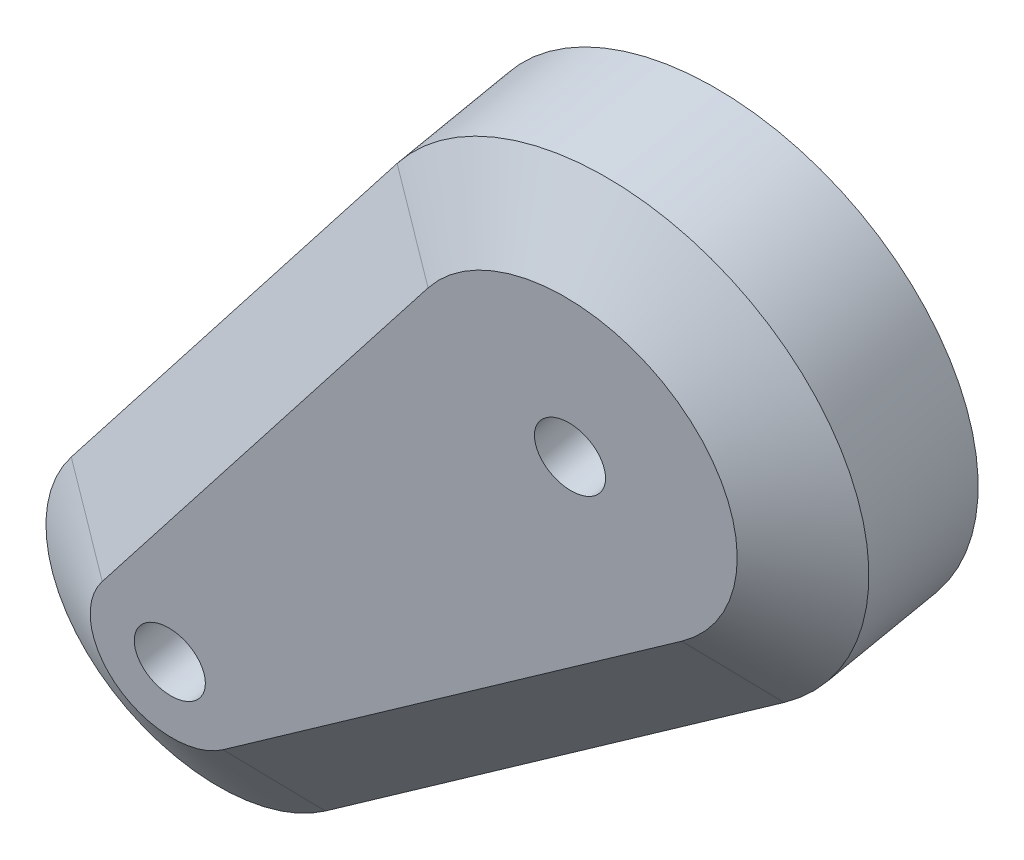
ISO-10303-21;
HEADER;
FILE_DESCRIPTION(('STEP AP214'),'2;1');
FILE_NAME('part.step','',(''),(''),'','','');
FILE_SCHEMA(('AUTOMOTIVE_DESIGN { 1 0 10303 214 1 1 1 1 }'));
ENDSEC;
DATA;
#1=APPLICATION_CONTEXT('core data for automotive mechanical design processes');
#2=APPLICATION_PROTOCOL_DEFINITION('international standard','automotive_design',2000,#1);
#3=PRODUCT_CONTEXT('',#1,'mechanical');
#4=PRODUCT('Part','Part','',(#3));
#5=PRODUCT_RELATED_PRODUCT_CATEGORY('part','',(#4));
#6=PRODUCT_DEFINITION_FORMATION('','',#4);
#7=PRODUCT_DEFINITION_CONTEXT('part definition',#1,'design');
#8=PRODUCT_DEFINITION('design','',#6,#7);
#9=PRODUCT_DEFINITION_SHAPE('','',#8);
#10=(LENGTH_UNIT() NAMED_UNIT(*) SI_UNIT(.MILLI.,.METRE.));
#11=(NAMED_UNIT(*) PLANE_ANGLE_UNIT() SI_UNIT($,.RADIAN.));
#12=(NAMED_UNIT(*) SI_UNIT($,.STERADIAN.) SOLID_ANGLE_UNIT());
#13=UNCERTAINTY_MEASURE_WITH_UNIT(LENGTH_MEASURE(1.E-05),#10,'distance_accuracy_value','');
#14=(GEOMETRIC_REPRESENTATION_CONTEXT(3) GLOBAL_UNCERTAINTY_ASSIGNED_CONTEXT((#13)) GLOBAL_UNIT_ASSIGNED_CONTEXT((#10,
#11,#12)) REPRESENTATION_CONTEXT('',''));
#15=CARTESIAN_POINT('',(0.,0.,0.));
#16=DIRECTION('',(0.,0.,1.));
#17=DIRECTION('',(1.,0.,0.));
#18=AXIS2_PLACEMENT_3D('',#15,#16,#17);
#19=CARTESIAN_POINT('',(139.042388148366,-142.913532001662,-5.92533887196867));
#20=DIRECTION('',(0.0674581133210909,-0.12352330189874,0.990046158941689));
#21=DIRECTION('',(0.,-0.992306526958391,-0.123805317154703));
#22=AXIS2_PLACEMENT_3D('',#19,#20,#21);
#23=PLANE('',#22);
#24=CARTESIAN_POINT('',(156.822676569582,-126.081367524923,-5.03675421849172));
#25=DIRECTION('',(0.0674581133210909,-0.12352330189874,0.990046158941689));
#26=DIRECTION('',(0.,-0.992306526958391,-0.123805317154703));
#27=AXIS2_PLACEMENT_3D('',#24,#25,#26);
#28=CIRCLE('',#27,6.58589838486229);
#29=CARTESIAN_POINT('',(160.613864154695,-131.38739760596,-5.95707970947262));
#30=VERTEX_POINT('',#29);
#31=CARTESIAN_POINT('',(151.685409363827,-122.049638120943,-4.18370017243479));
#32=VERTEX_POINT('',#31);
#33=EDGE_CURVE('E190',#30,#32,#28,.T.);
#34=ORIENTED_EDGE('',*,*,#33,.T.);
#35=DIRECTION('',(-0.622082216176631,-0.781013732742278,-0.0550569303970384));
#36=VECTOR('',#35,1.);
#37=CARTESIAN_POINT('',(136.596260529671,-140.993810046157,-5.51915422578908));
#38=LINE('',#37,#36);
#39=CARTESIAN_POINT('',(136.596260529671,-140.993810046157,-5.51915422578908));
#40=VERTEX_POINT('',#39);
#41=EDGE_CURVE('E194',#32,#40,#38,.T.);
#42=ORIENTED_EDGE('',*,*,#41,.T.);
#43=CARTESIAN_POINT('',(139.042388148366,-142.913532001662,-5.92533887196867));
#44=DIRECTION('',(0.0674581133210909,-0.12352330189874,0.990046158941689));
#45=DIRECTION('',(0.,-0.992306526958391,-0.123805317154703));
#46=AXIS2_PLACEMENT_3D('',#43,#44,#45);
#47=CIRCLE('',#46,3.13589838486216);
#48=CARTESIAN_POINT('',(140.847575281559,-145.440016649436,-6.36355505024256));
#49=VERTEX_POINT('',#48);
#50=EDGE_CURVE('E192',#40,#49,#47,.T.);
#51=ORIENTED_EDGE('',*,*,#50,.T.);
#52=DIRECTION('',(0.814907250431126,0.579349073545028,0.0167578094421691));
#53=VECTOR('',#52,1.);
#54=CARTESIAN_POINT('',(140.847575281559,-145.440016649436,-6.36355505024256));
#55=LINE('',#54,#53);
#56=EDGE_CURVE('E188',#49,#30,#55,.T.);
#57=ORIENTED_EDGE('',*,*,#56,.T.);
#58=EDGE_LOOP('',(#34,#42,#51,#57));
#59=FACE_BOUND('',#58,.T.);
#60=CARTESIAN_POINT('',(156.822676569582,-126.081367524923,-5.03675421849172));
#61=DIRECTION('',(0.0674581133210909,-0.12352330189874,0.990046158941689));
#62=DIRECTION('',(0.,-0.992306526958391,-0.123805317154703));
#63=AXIS2_PLACEMENT_3D('',#60,#61,#62);
#64=CIRCLE('',#63,1.40000000000001);
#65=CARTESIAN_POINT('',(156.822676569582,-127.470596662665,-5.2100816625083));
#66=VERTEX_POINT('',#65);
#67=EDGE_CURVE('E143',#66,#66,#64,.T.);
#68=ORIENTED_EDGE('',*,*,#67,.F.);
#69=EDGE_LOOP('',(#68));
#70=FACE_BOUND('',#69,.T.);
#71=CARTESIAN_POINT('',(139.042388148366,-142.913532001662,-5.92533887196866));
#72=DIRECTION('',(0.0674581133210909,-0.12352330189874,0.990046158941689));
#73=DIRECTION('',(0.,-0.992306526958391,-0.123805317154703));
#74=AXIS2_PLACEMENT_3D('',#71,#72,#73);
#75=CIRCLE('',#74,1.40000000000001);
#76=CARTESIAN_POINT('',(139.042388148366,-144.302761139403,-6.09866631598525));
#77=VERTEX_POINT('',#76);
#78=EDGE_CURVE('E146',#77,#77,#75,.T.);
#79=ORIENTED_EDGE('',*,*,#78,.F.);
#80=EDGE_LOOP('',(#79));
#81=FACE_BOUND('',#80,.T.);
#82=ADVANCED_FACE('F39',(#59,#70,#81),#23,.T.);
#83=CARTESIAN_POINT('',(138.570181355119,-142.048868888371,-12.8556619845605));
#84=DIRECTION('',(0.0674581133210909,-0.12352330189874,0.990046158941689));
#85=DIRECTION('',(0.,-0.992306526958391,-0.123805317154703));
#86=AXIS2_PLACEMENT_3D('',#83,#84,#85);
#87=CYLINDRICAL_SURFACE('',#86,4.10000000000003);
#88=DIRECTION('',(0.0674581133210909,-0.12352330189874,0.990046158941689));
#89=VECTOR('',#88,1.);
#90=CARTESIAN_POINT('',(135.372015469048,-139.538946993081,-12.324599799199));
#91=LINE('',#90,#89);
#92=CARTESIAN_POINT('',(135.372015469048,-139.538946993081,-12.324599799199));
#93=VERTEX_POINT('',#92);
#94=CARTESIAN_POINT('',(135.675576978993,-140.094801851626,-7.86939208396144));
#95=VERTEX_POINT('',#94);
#96=EDGE_CURVE('E152',#93,#95,#91,.T.);
#97=ORIENTED_EDGE('',*,*,#96,.T.);
#98=CARTESIAN_POINT('',(138.873742865064,-142.604723746915,-8.40045426932289));
#99=DIRECTION('',(0.0674581133210909,-0.12352330189874,0.990046158941689));
#100=DIRECTION('',(0.,-0.992306526958391,-0.123805317154703));
#101=AXIS2_PLACEMENT_3D('',#98,#99,#100);
#102=CIRCLE('',#101,4.10000000000001);
#103=CARTESIAN_POINT('',(141.233917315172,-145.907951653111,-8.97339577138049));
#104=VERTEX_POINT('',#103);
#105=EDGE_CURVE('E125',#95,#104,#102,.T.);
#106=ORIENTED_EDGE('',*,*,#105,.T.);
#107=DIRECTION('',(0.0674581133210909,-0.12352330189874,0.990046158941689));
#108=VECTOR('',#107,1.);
#109=CARTESIAN_POINT('',(140.930355805227,-145.352096794567,-13.4286034866181));
#110=LINE('',#109,#108);
#111=CARTESIAN_POINT('',(140.930355805227,-145.352096794567,-13.4286034866181));
#112=VERTEX_POINT('',#111);
#113=EDGE_CURVE('E118',#112,#104,#110,.T.);
#114=ORIENTED_EDGE('',*,*,#113,.F.);
#115=CARTESIAN_POINT('',(138.570181355119,-142.048868888371,-12.8556619845605));
#116=DIRECTION('',(0.0674581133210909,-0.12352330189874,0.990046158941689));
#117=DIRECTION('',(0.,-0.992306526958391,-0.123805317154703));
#118=AXIS2_PLACEMENT_3D('',#115,#116,#117);
#119=CIRCLE('',#118,4.10000000000003);
#120=EDGE_CURVE('E123',#93,#112,#119,.T.);
#121=ORIENTED_EDGE('',*,*,#120,.F.);
#122=EDGE_LOOP('',(#97,#106,#114,#121));
#123=FACE_BOUND('',#122,.T.);
#124=ADVANCED_FACE('F121',(#123),#87,.F.);
#125=CARTESIAN_POINT('',(150.461164303204,-120.594775067867,-10.9891457458448));
#126=DIRECTION('',(-0.780040460017252,0.612176072021776,0.12952736228328));
#127=DIRECTION('',(-0.617376949257776,-0.786667466293835,0.));
#128=AXIS2_PLACEMENT_3D('',#125,#126,#127);
#129=PLANE('',#128);
#130=DIRECTION('',(0.0674581133210909,-0.12352330189874,0.990046158941689));
#131=VECTOR('',#130,1.);
#132=CARTESIAN_POINT('',(150.461164303204,-120.594775067867,-10.9891457458448));
#133=LINE('',#132,#131);
#134=CARTESIAN_POINT('',(150.461164303204,-120.594775067867,-10.9891457458448));
#135=VERTEX_POINT('',#134);
#136=CARTESIAN_POINT('',(150.764725813149,-121.150629926412,-6.53393803060717));
#137=VERTEX_POINT('',#136);
#138=EDGE_CURVE('E155',#135,#137,#133,.T.);
#139=ORIENTED_EDGE('',*,*,#138,.T.);
#140=DIRECTION('',(-0.622082216176634,-0.781013732742276,-0.0550569303970381));
#141=VECTOR('',#140,1.);
#142=CARTESIAN_POINT('',(135.675576978993,-140.094801851626,-7.86939208396144));
#143=LINE('',#142,#141);
#144=EDGE_CURVE('E185',#137,#95,#143,.T.);
#145=ORIENTED_EDGE('',*,*,#144,.T.);
#146=ORIENTED_EDGE('',*,*,#96,.F.);
#147=DIRECTION('',(-0.622082216176635,-0.781013732742275,-0.055056930397038));
#148=VECTOR('',#147,1.);
#149=CARTESIAN_POINT('',(150.461164303204,-120.594775067867,-10.9891457458448));
#150=LINE('',#149,#148);
#151=EDGE_CURVE('E129',#135,#93,#150,.T.);
#152=ORIENTED_EDGE('',*,*,#151,.F.);
#153=EDGE_LOOP('',(#139,#145,#146,#152));
#154=FACE_BOUND('',#153,.T.);
#155=ADVANCED_FACE('F235',(#154),#129,.F.);
#156=CARTESIAN_POINT('',(156.350469776334,-125.216704411632,-11.9670773310835));
#157=DIRECTION('',(0.0674581133210909,-0.12352330189874,0.990046158941689));
#158=DIRECTION('',(0.,-0.992306526958391,-0.123805317154703));
#159=AXIS2_PLACEMENT_3D('',#156,#157,#158);
#160=CYLINDRICAL_SURFACE('',#159,7.55000000000003);
#161=DIRECTION('',(0.0674581133210909,-0.12352330189874,0.990046158941689));
#162=VECTOR('',#161,1.);
#163=CARTESIAN_POINT('',(160.696644678364,-131.299477751091,-13.0221281458481));
#164=LINE('',#163,#162);
#165=CARTESIAN_POINT('',(160.696644678364,-131.299477751091,-13.0221281458481));
#166=VERTEX_POINT('',#165);
#167=CARTESIAN_POINT('',(161.000206188309,-131.855332609635,-8.56692043061055));
#168=VERTEX_POINT('',#167);
#169=EDGE_CURVE('E128',#166,#168,#164,.T.);
#170=ORIENTED_EDGE('',*,*,#169,.T.);
#171=CARTESIAN_POINT('',(156.654031286279,-125.772559270176,-7.51186961584594));
#172=DIRECTION('',(0.0674581133210909,-0.12352330189874,0.990046158941689));
#173=DIRECTION('',(0.,-0.992306526958391,-0.123805317154703));
#174=AXIS2_PLACEMENT_3D('',#171,#172,#173);
#175=CIRCLE('',#174,7.55000000000001);
#176=EDGE_CURVE('E182',#168,#137,#175,.T.);
#177=ORIENTED_EDGE('',*,*,#176,.T.);
#178=ORIENTED_EDGE('',*,*,#138,.F.);
#179=CARTESIAN_POINT('',(156.350469776334,-125.216704411632,-11.9670773310835));
#180=DIRECTION('',(0.0674581133210909,-0.12352330189874,0.990046158941689));
#181=DIRECTION('',(0.,-0.992306526958391,-0.123805317154703));
#182=AXIS2_PLACEMENT_3D('',#179,#180,#181);
#183=CIRCLE('',#182,7.55000000000003);
#184=EDGE_CURVE('E138',#166,#135,#183,.T.);
#185=ORIENTED_EDGE('',*,*,#184,.F.);
#186=EDGE_LOOP('',(#170,#177,#178,#185));
#187=FACE_BOUND('',#186,.T.);
#188=ADVANCED_FACE('F299',(#187),#160,.F.);
#189=CARTESIAN_POINT('',(140.930355805227,-145.352096794567,-13.4286034866181));
#190=DIRECTION('',(0.575652304904566,-0.805665342974707,-0.139741829770146));
#191=DIRECTION('',(0.813648888188022,0.581356591732128,0.));
#192=AXIS2_PLACEMENT_3D('',#189,#190,#191);
#193=PLANE('',#192);
#194=ORIENTED_EDGE('',*,*,#113,.T.);
#195=DIRECTION('',(0.814907250431126,0.579349073545027,0.0167578094421692));
#196=VECTOR('',#195,1.);
#197=CARTESIAN_POINT('',(141.233917315172,-145.907951653111,-8.97339577138049));
#198=LINE('',#197,#196);
#199=EDGE_CURVE('E180',#104,#168,#198,.T.);
#200=ORIENTED_EDGE('',*,*,#199,.T.);
#201=ORIENTED_EDGE('',*,*,#169,.F.);
#202=DIRECTION('',(0.814907250431127,0.579349073545026,0.016757809442169));
#203=VECTOR('',#202,1.);
#204=CARTESIAN_POINT('',(140.930355805227,-145.352096794567,-13.4286034866181));
#205=LINE('',#204,#203);
#206=EDGE_CURVE('E133',#112,#166,#205,.T.);
#207=ORIENTED_EDGE('',*,*,#206,.F.);
#208=EDGE_LOOP('',(#194,#200,#201,#207));
#209=FACE_BOUND('',#208,.T.);
#210=ADVANCED_FACE('F134',(#209),#193,.F.);
#211=CARTESIAN_POINT('',(138.570181355119,-142.048868888371,-12.8556619845605));
#212=DIRECTION('',(0.0674581133210909,-0.12352330189874,0.990046158941689));
#213=DIRECTION('',(0.,-0.992306526958391,-0.123805317154703));
#214=AXIS2_PLACEMENT_3D('',#211,#212,#213);
#215=CYLINDRICAL_SURFACE('',#214,6.6);
#216=DIRECTION('',(0.0674581133210909,-0.12352330189874,0.990046158941689));
#217=VECTOR('',#216,1.);
#218=CARTESIAN_POINT('',(142.369486567489,-147.366260152004,-13.7779580610435));
#219=LINE('',#218,#217);
#220=CARTESIAN_POINT('',(142.369486567489,-147.366260152004,-13.7779580610435));
#221=VERTEX_POINT('',#220);
#222=CARTESIAN_POINT('',(142.706777134094,-147.983876661497,-8.82772726633504));
#223=VERTEX_POINT('',#222);
#224=EDGE_CURVE('E170',#221,#223,#219,.T.);
#225=ORIENTED_EDGE('',*,*,#224,.T.);
#226=CARTESIAN_POINT('',(138.907471921724,-142.666485397864,-7.90543118985206));
#227=DIRECTION('',(0.0674581133210945,-0.123523301898742,0.990046158941688));
#228=DIRECTION('',(0.,-0.99230652695839,-0.123805317154705));
#229=AXIS2_PLACEMENT_3D('',#226,#227,#228);
#230=CIRCLE('',#229,6.6);
#231=CARTESIAN_POINT('',(133.75920488561,-138.626123322521,-7.05055059878238));
#232=VERTEX_POINT('',#231);
#233=EDGE_CURVE('E200',#223,#232,#230,.F.);
#234=ORIENTED_EDGE('',*,*,#233,.T.);
#235=DIRECTION('',(0.0674581133210909,-0.12352330189874,0.990046158941689));
#236=VECTOR('',#235,1.);
#237=CARTESIAN_POINT('',(133.421914319005,-138.008506813027,-12.0007813934908));
#238=LINE('',#237,#236);
#239=CARTESIAN_POINT('',(133.421914319005,-138.008506813027,-12.0007813934908));
#240=VERTEX_POINT('',#239);
#241=EDGE_CURVE('E171',#240,#232,#238,.T.);
#242=ORIENTED_EDGE('',*,*,#241,.F.);
#243=CARTESIAN_POINT('',(138.570181355119,-142.048868888371,-12.8556619845605));
#244=DIRECTION('',(0.0674581133210909,-0.12352330189874,0.990046158941689));
#245=DIRECTION('',(0.,-0.992306526958391,-0.123805317154703));
#246=AXIS2_PLACEMENT_3D('',#243,#244,#245);
#247=CIRCLE('',#246,6.6);
#248=EDGE_CURVE('E154',#240,#221,#247,.T.);
#249=ORIENTED_EDGE('',*,*,#248,.T.);
#250=EDGE_LOOP('',(#225,#234,#242,#249));
#251=FACE_BOUND('',#250,.T.);
#252=ADVANCED_FACE('F240',(#251),#215,.T.);
#253=CARTESIAN_POINT('',(148.511063153161,-119.064334887813,-10.6653273401366));
#254=DIRECTION('',(-0.780040460017255,0.612176072021772,0.12952736228328));
#255=DIRECTION('',(-0.617376949257772,-0.786667466293838,0.));
#256=AXIS2_PLACEMENT_3D('',#253,#254,#255);
#257=PLANE('',#256);
#258=ORIENTED_EDGE('',*,*,#241,.T.);
#259=DIRECTION('',(0.622082216176631,0.781013732742278,0.0550569303970384));
#260=VECTOR('',#259,1.);
#261=CARTESIAN_POINT('',(148.848353719766,-119.681951397307,-5.71509654542814));
#262=LINE('',#261,#260);
#263=CARTESIAN_POINT('',(148.848353719766,-119.681951397307,-5.71509654542811));
#264=VERTEX_POINT('',#263);
#265=EDGE_CURVE('E197',#232,#264,#262,.T.);
#266=ORIENTED_EDGE('',*,*,#265,.T.);
#267=DIRECTION('',(0.0674581133210909,-0.12352330189874,0.990046158941689));
#268=VECTOR('',#267,1.);
#269=CARTESIAN_POINT('',(148.511063153161,-119.064334887813,-10.6653273401366));
#270=LINE('',#269,#268);
#271=CARTESIAN_POINT('',(148.511063153161,-119.064334887813,-10.6653273401366));
#272=VERTEX_POINT('',#271);
#273=EDGE_CURVE('E174',#272,#264,#270,.T.);
#274=ORIENTED_EDGE('',*,*,#273,.F.);
#275=DIRECTION('',(-0.622082216176631,-0.781013732742278,-0.0550569303970383));
#276=VECTOR('',#275,1.);
#277=CARTESIAN_POINT('',(148.511063153161,-119.064334887813,-10.6653273401366));
#278=LINE('',#277,#276);
#279=EDGE_CURVE('E167',#272,#240,#278,.T.);
#280=ORIENTED_EDGE('',*,*,#279,.T.);
#281=EDGE_LOOP('',(#258,#266,#274,#280));
#282=FACE_BOUND('',#281,.T.);
#283=ADVANCED_FACE('F279',(#282),#257,.T.);
#284=CARTESIAN_POINT('',(156.350469776334,-125.216704411632,-11.9670773310835));
#285=DIRECTION('',(0.0674581133210909,-0.12352330189874,0.990046158941689));
#286=DIRECTION('',(0.,-0.992306526958391,-0.123805317154703));
#287=AXIS2_PLACEMENT_3D('',#284,#285,#286);
#288=CYLINDRICAL_SURFACE('',#287,10.05);
#289=ORIENTED_EDGE('',*,*,#273,.T.);
#290=CARTESIAN_POINT('',(156.68776034294,-125.834320921126,-7.01684653637512));
#291=DIRECTION('',(0.0674581133210946,-0.123523301898742,0.990046158941688));
#292=DIRECTION('',(0.,-0.99230652695839,-0.123805317154705));
#293=AXIS2_PLACEMENT_3D('',#290,#291,#292);
#294=CIRCLE('',#293,10.05);
#295=CARTESIAN_POINT('',(162.473066007231,-133.931257618021,-8.42125192556509));
#296=VERTEX_POINT('',#295);
#297=EDGE_CURVE('E49',#264,#296,#294,.F.);
#298=ORIENTED_EDGE('',*,*,#297,.T.);
#299=DIRECTION('',(0.0674581133210909,-0.12352330189874,0.990046158941689));
#300=VECTOR('',#299,1.);
#301=CARTESIAN_POINT('',(162.135775440625,-133.313641108528,-13.3714827202735));
#302=LINE('',#301,#300);
#303=CARTESIAN_POINT('',(162.135775440625,-133.313641108528,-13.3714827202735));
#304=VERTEX_POINT('',#303);
#305=EDGE_CURVE('E176',#304,#296,#302,.T.);
#306=ORIENTED_EDGE('',*,*,#305,.F.);
#307=CARTESIAN_POINT('',(156.350469776334,-125.216704411632,-11.9670773310835));
#308=DIRECTION('',(0.0674581133210909,-0.12352330189874,0.990046158941689));
#309=DIRECTION('',(0.,-0.992306526958391,-0.123805317154703));
#310=AXIS2_PLACEMENT_3D('',#307,#308,#309);
#311=CIRCLE('',#310,10.05);
#312=EDGE_CURVE('E164',#304,#272,#311,.T.);
#313=ORIENTED_EDGE('',*,*,#312,.T.);
#314=EDGE_LOOP('',(#289,#298,#306,#313));
#315=FACE_BOUND('',#314,.T.);
#316=ADVANCED_FACE('F286',(#315),#288,.T.);
#317=CARTESIAN_POINT('',(142.369486567489,-147.366260152004,-13.7779580610435));
#318=DIRECTION('',(0.575652304904567,-0.805665342974706,-0.139741829770146));
#319=DIRECTION('',(0.813648888188021,0.58135659173213,0.));
#320=AXIS2_PLACEMENT_3D('',#317,#318,#319);
#321=PLANE('',#320);
#322=ORIENTED_EDGE('',*,*,#305,.T.);
#323=DIRECTION('',(-0.814907250431126,-0.579349073545028,-0.0167578094421691));
#324=VECTOR('',#323,1.);
#325=CARTESIAN_POINT('',(142.706777134094,-147.983876661497,-8.82772726633504));
#326=LINE('',#325,#324);
#327=EDGE_CURVE('E11',#296,#223,#326,.T.);
#328=ORIENTED_EDGE('',*,*,#327,.T.);
#329=ORIENTED_EDGE('',*,*,#224,.F.);
#330=DIRECTION('',(0.814907250431126,0.579349073545028,0.0167578094421692));
#331=VECTOR('',#330,1.);
#332=CARTESIAN_POINT('',(142.369486567489,-147.366260152004,-13.7779580610435));
#333=LINE('',#332,#331);
#334=EDGE_CURVE('E161',#221,#304,#333,.T.);
#335=ORIENTED_EDGE('',*,*,#334,.T.);
#336=EDGE_LOOP('',(#322,#328,#329,#335));
#337=FACE_BOUND('',#336,.T.);
#338=ADVANCED_FACE('F285',(#337),#321,.T.);
#339=CARTESIAN_POINT('',(138.570181355119,-142.048868888371,-12.8556619845605));
#340=DIRECTION('',(0.0674581133210909,-0.12352330189874,0.990046158941689));
#341=DIRECTION('',(0.,-0.992306526958391,-0.123805317154703));
#342=AXIS2_PLACEMENT_3D('',#339,#340,#341);
#343=PLANE('',#342);
#344=ORIENTED_EDGE('',*,*,#151,.T.);
#345=ORIENTED_EDGE('',*,*,#120,.T.);
#346=ORIENTED_EDGE('',*,*,#206,.T.);
#347=ORIENTED_EDGE('',*,*,#184,.T.);
#348=EDGE_LOOP('',(#344,#345,#346,#347));
#349=FACE_BOUND('',#348,.T.);
#350=ORIENTED_EDGE('',*,*,#248,.F.);
#351=ORIENTED_EDGE('',*,*,#279,.F.);
#352=ORIENTED_EDGE('',*,*,#312,.F.);
#353=ORIENTED_EDGE('',*,*,#334,.F.);
#354=EDGE_LOOP('',(#350,#351,#352,#353));
#355=FACE_BOUND('',#354,.T.);
#356=ADVANCED_FACE('F140',(#349,#355),#343,.F.);
#357=CARTESIAN_POINT('',(138.873742865064,-142.604723746915,-8.40045426932289));
#358=DIRECTION('',(0.0674581133210909,-0.12352330189874,0.990046158941689));
#359=DIRECTION('',(0.,-0.992306526958391,-0.123805317154703));
#360=AXIS2_PLACEMENT_3D('',#357,#358,#359);
#361=PLANE('',#360);
#362=CARTESIAN_POINT('',(156.654031286279,-125.772559270176,-7.51186961584597));
#363=DIRECTION('',(-0.0674581133210908,0.12352330189874,-0.990046158941689));
#364=DIRECTION('',(0.,0.992306526958391,0.123805317154703));
#365=AXIS2_PLACEMENT_3D('',#362,#363,#364);
#366=CIRCLE('',#365,1.40000000000001);
#367=CARTESIAN_POINT('',(156.654031286279,-124.383330132434,-7.33854217182938));
#368=VERTEX_POINT('',#367);
#369=EDGE_CURVE('E218',#368,#368,#366,.T.);
#370=ORIENTED_EDGE('',*,*,#369,.F.);
#371=EDGE_LOOP('',(#370));
#372=FACE_BOUND('',#371,.T.);
#373=CARTESIAN_POINT('',(138.873742865063,-142.604723746915,-8.40045426932291));
#374=DIRECTION('',(-0.0674581133210908,0.12352330189874,-0.990046158941689));
#375=DIRECTION('',(0.,0.992306526958391,0.123805317154703));
#376=AXIS2_PLACEMENT_3D('',#373,#374,#375);
#377=CIRCLE('',#376,1.40000000000001);
#378=CARTESIAN_POINT('',(138.873742865063,-141.215494609173,-8.22712682530633));
#379=VERTEX_POINT('',#378);
#380=EDGE_CURVE('E213',#379,#379,#377,.T.);
#381=ORIENTED_EDGE('',*,*,#380,.F.);
#382=EDGE_LOOP('',(#381));
#383=FACE_BOUND('',#382,.T.);
#384=ORIENTED_EDGE('',*,*,#105,.F.);
#385=ORIENTED_EDGE('',*,*,#144,.F.);
#386=ORIENTED_EDGE('',*,*,#176,.F.);
#387=ORIENTED_EDGE('',*,*,#199,.F.);
#388=EDGE_LOOP('',(#384,#385,#386,#387));
#389=FACE_BOUND('',#388,.T.);
#390=ADVANCED_FACE('F242',(#372,#383,#389),#361,.F.);
#391=CARTESIAN_POINT('',(139.377315842078,-143.526821828308,-1.00978668176809));
#392=DIRECTION('',(-0.0674581133210909,0.12352330189874,-0.990046158941689));
#393=DIRECTION('',(0.,0.992306526958391,0.123805317154703));
#394=AXIS2_PLACEMENT_3D('',#391,#392,#393);
#395=CYLINDRICAL_SURFACE('',#394,1.40000000000001);
#396=ORIENTED_EDGE('',*,*,#78,.T.);
#397=EDGE_LOOP('',(#396));
#398=FACE_BOUND('',#397,.T.);
#399=ORIENTED_EDGE('',*,*,#380,.T.);
#400=EDGE_LOOP('',(#399));
#401=FACE_BOUND('',#400,.T.);
#402=ADVANCED_FACE('F227',(#398,#401),#395,.F.);
#403=CARTESIAN_POINT('',(157.157604263294,-126.694657351569,-0.121202028291147));
#404=DIRECTION('',(-0.0674581133210909,0.12352330189874,-0.990046158941689));
#405=DIRECTION('',(0.,0.992306526958391,0.123805317154703));
#406=AXIS2_PLACEMENT_3D('',#403,#404,#405);
#407=CYLINDRICAL_SURFACE('',#406,1.40000000000001);
#408=ORIENTED_EDGE('',*,*,#67,.T.);
#409=EDGE_LOOP('',(#408));
#410=FACE_BOUND('',#409,.T.);
#411=ORIENTED_EDGE('',*,*,#369,.T.);
#412=EDGE_LOOP('',(#411));
#413=FACE_BOUND('',#412,.T.);
#414=ADVANCED_FACE('F266',(#410,#413),#407,.F.);
#415=CARTESIAN_POINT('',(140.847575281559,-145.440016649436,-6.36355505024256));
#416=DIRECTION('',(-0.346246592279718,0.509806988890996,-0.787534209677636));
#417=DIRECTION('',(0.814907250431126,0.579349073545028,0.0167578094421691));
#418=AXIS2_PLACEMENT_3D('',#415,#416,#417);
#419=PLANE('',#418);
#420=DIRECTION('',(-0.464800463133868,0.635965003015431,0.616043054023113));
#421=VECTOR('',#420,1.);
#422=CARTESIAN_POINT('',(142.706777134094,-147.983876661497,-8.82772726633504));
#423=LINE('',#422,#421);
#424=EDGE_CURVE('E206',#223,#49,#423,.T.);
#425=ORIENTED_EDGE('',*,*,#424,.F.);
#426=ORIENTED_EDGE('',*,*,#327,.F.);
#427=DIRECTION('',(0.464800463133874,-0.635965003015429,-0.616043054023111));
#428=VECTOR('',#427,1.);
#429=CARTESIAN_POINT('',(160.613864154695,-131.38739760596,-5.95707970947262));
#430=LINE('',#429,#428);
#431=EDGE_CURVE('E44',#30,#296,#430,.T.);
#432=ORIENTED_EDGE('',*,*,#431,.F.);
#433=ORIENTED_EDGE('',*,*,#56,.F.);
#434=EDGE_LOOP('',(#425,#426,#432,#433));
#435=FACE_BOUND('',#434,.T.);
#436=ADVANCED_FACE('F42',(#435),#419,.F.);
#437=CARTESIAN_POINT('',(156.822676569582,-126.081367524923,-5.03675421849172));
#438=DIRECTION('',(-0.0674581133210946,0.123523301898742,-0.990046158941688));
#439=DIRECTION('',(0.,0.99230652695839,0.123805317154705));
#440=AXIS2_PLACEMENT_3D('',#437,#438,#439);
#441=CONICAL_SURFACE('',#440,6.58589838486223,1.0471975511966);
#442=ORIENTED_EDGE('',*,*,#431,.T.);
#443=ORIENTED_EDGE('',*,*,#297,.F.);
#444=DIRECTION('',(-0.709263911015186,0.5919216809092,-0.382849093248331));
#445=VECTOR('',#444,1.);
#446=CARTESIAN_POINT('',(151.685409363827,-122.049638120943,-4.18370017243479));
#447=LINE('',#446,#445);
#448=EDGE_CURVE('E205',#32,#264,#447,.T.);
#449=ORIENTED_EDGE('',*,*,#448,.F.);
#450=ORIENTED_EDGE('',*,*,#33,.F.);
#451=EDGE_LOOP('',(#442,#443,#449,#450));
#452=FACE_BOUND('',#451,.T.);
#453=ADVANCED_FACE('F259',(#452),#441,.T.);
#454=CARTESIAN_POINT('',(139.042388148366,-142.913532001662,-5.92533887196867));
#455=DIRECTION('',(-0.0674581133210945,0.123523301898742,-0.990046158941688));
#456=DIRECTION('',(0.,0.99230652695839,0.123805317154705));
#457=AXIS2_PLACEMENT_3D('',#454,#455,#456);
#458=CONICAL_SURFACE('',#457,3.13589838486218,1.0471975511966);
#459=ORIENTED_EDGE('',*,*,#424,.T.);
#460=ORIENTED_EDGE('',*,*,#50,.F.);
#461=DIRECTION('',(0.709263911015196,-0.591921680909196,0.382849093248319));
#462=VECTOR('',#461,1.);
#463=CARTESIAN_POINT('',(133.75920488561,-138.626123322521,-7.05055059878238));
#464=LINE('',#463,#462);
#465=EDGE_CURVE('E203',#232,#40,#464,.T.);
#466=ORIENTED_EDGE('',*,*,#465,.F.);
#467=ORIENTED_EDGE('',*,*,#233,.F.);
#468=EDGE_LOOP('',(#459,#460,#466,#467));
#469=FACE_BOUND('',#468,.T.);
#470=ADVANCED_FACE('F253',(#469),#458,.T.);
#471=CARTESIAN_POINT('',(136.596260529671,-140.993810046157,-5.51915422578908));
#472=DIRECTION('',(0.331599790181188,-0.199113718607239,-0.922168805704351));
#473=DIRECTION('',(-0.622082216176631,-0.781013732742278,-0.0550569303970384));
#474=AXIS2_PLACEMENT_3D('',#471,#472,#473);
#475=PLANE('',#474);
#476=ORIENTED_EDGE('',*,*,#448,.T.);
#477=ORIENTED_EDGE('',*,*,#265,.F.);
#478=ORIENTED_EDGE('',*,*,#465,.T.);
#479=ORIENTED_EDGE('',*,*,#41,.F.);
#480=EDGE_LOOP('',(#476,#477,#478,#479));
#481=FACE_BOUND('',#480,.T.);
#482=ADVANCED_FACE('F247',(#481),#475,.F.);
#483=CLOSED_SHELL('',(#82,#124,#155,#188,#210,#252,#283,#316,#338,#356,#390,#402,#414,#436,#453,
#470,#482));
#484=MANIFOLD_SOLID_BREP('B2',#483);
#485=ADVANCED_BREP_SHAPE_REPRESENTATION('',(#18,#484),#14);
#486=SHAPE_DEFINITION_REPRESENTATION(#9,#485);
ENDSEC;
END-ISO-10303-21;
